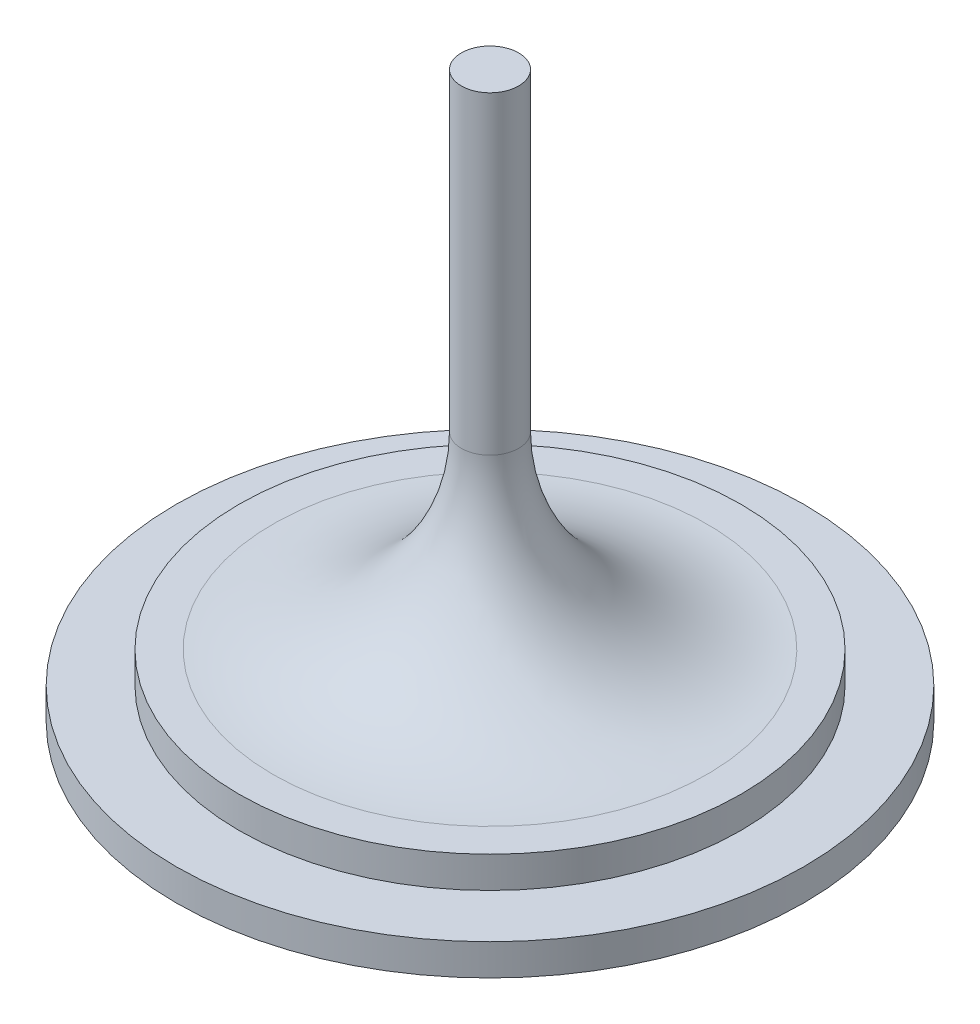
ISO-10303-21;
HEADER;
FILE_DESCRIPTION(('STEP AP214'),'2;1');
FILE_NAME('part.step','',(''),(''),'','','');
FILE_SCHEMA(('AUTOMOTIVE_DESIGN { 1 0 10303 214 1 1 1 1 }'));
ENDSEC;
DATA;
#1=APPLICATION_CONTEXT('core data for automotive mechanical design processes');
#2=APPLICATION_PROTOCOL_DEFINITION('international standard','automotive_design',2000,#1);
#3=PRODUCT_CONTEXT('',#1,'mechanical');
#4=PRODUCT('Part','Part','',(#3));
#5=PRODUCT_RELATED_PRODUCT_CATEGORY('part','',(#4));
#6=PRODUCT_DEFINITION_FORMATION('','',#4);
#7=PRODUCT_DEFINITION_CONTEXT('part definition',#1,'design');
#8=PRODUCT_DEFINITION('design','',#6,#7);
#9=PRODUCT_DEFINITION_SHAPE('','',#8);
#10=(LENGTH_UNIT() NAMED_UNIT(*) SI_UNIT(.MILLI.,.METRE.));
#11=(NAMED_UNIT(*) PLANE_ANGLE_UNIT() SI_UNIT($,.RADIAN.));
#12=(NAMED_UNIT(*) SI_UNIT($,.STERADIAN.) SOLID_ANGLE_UNIT());
#13=UNCERTAINTY_MEASURE_WITH_UNIT(LENGTH_MEASURE(1.E-05),#10,'distance_accuracy_value','');
#14=(GEOMETRIC_REPRESENTATION_CONTEXT(3) GLOBAL_UNCERTAINTY_ASSIGNED_CONTEXT((#13)) GLOBAL_UNIT_ASSIGNED_CONTEXT((#10,
#11,#12)) REPRESENTATION_CONTEXT('',''));
#15=CARTESIAN_POINT('',(0.,0.,0.));
#16=DIRECTION('',(0.,0.,1.));
#17=DIRECTION('',(1.,0.,0.));
#18=AXIS2_PLACEMENT_3D('',#15,#16,#17);
#19=CARTESIAN_POINT('',(2.9,57.15,0.));
#20=DIRECTION('',(0.,-1.,0.));
#21=DIRECTION('',(0.,0.,-1.));
#22=AXIS2_PLACEMENT_3D('',#19,#20,#21);
#23=PLANE('',#22);
#24=CARTESIAN_POINT('',(0.,57.15,0.));
#25=DIRECTION('',(0.,1.,0.));
#26=DIRECTION('',(0.,0.,1.));
#27=AXIS2_PLACEMENT_3D('',#24,#25,#26);
#28=CIRCLE('',#27,2.9);
#29=CARTESIAN_POINT('',(0.,57.15,2.9));
#30=VERTEX_POINT('',#29);
#31=EDGE_CURVE('E10',#30,#30,#28,.T.);
#32=ORIENTED_EDGE('',*,*,#31,.T.);
#33=EDGE_LOOP('',(#32));
#34=FACE_BOUND('',#33,.T.);
#35=ADVANCED_FACE('F43',(#34),#23,.F.);
#36=CARTESIAN_POINT('',(0.,0.,0.));
#37=DIRECTION('',(0.,1.,0.));
#38=DIRECTION('',(0.,0.,1.));
#39=AXIS2_PLACEMENT_3D('',#36,#37,#38);
#40=CYLINDRICAL_SURFACE('',#39,2.9);
#41=ORIENTED_EDGE('',*,*,#31,.F.);
#42=EDGE_LOOP('',(#41));
#43=FACE_BOUND('',#42,.T.);
#44=CARTESIAN_POINT('',(0.,25.4,0.));
#45=DIRECTION('',(0.,1.,0.));
#46=DIRECTION('',(0.,0.,1.));
#47=AXIS2_PLACEMENT_3D('',#44,#45,#46);
#48=CIRCLE('',#47,2.9);
#49=CARTESIAN_POINT('',(0.,25.4,2.9));
#50=VERTEX_POINT('',#49);
#51=EDGE_CURVE('E50',#50,#50,#48,.T.);
#52=ORIENTED_EDGE('',*,*,#51,.T.);
#53=EDGE_LOOP('',(#52));
#54=FACE_BOUND('',#53,.T.);
#55=ADVANCED_FACE('F91',(#43,#54),#40,.T.);
#56=CARTESIAN_POINT('',(0.,25.4,0.));
#57=DIRECTION('',(0.,1.,0.));
#58=DIRECTION('',(0.,0.,1.));
#59=AXIS2_PLACEMENT_3D('',#56,#57,#58);
#60=TOROIDAL_SURFACE('',#59,21.95,19.05);
#61=ORIENTED_EDGE('',*,*,#51,.F.);
#62=EDGE_LOOP('',(#61));
#63=FACE_BOUND('',#62,.T.);
#64=CARTESIAN_POINT('',(0.,6.35,0.));
#65=DIRECTION('',(0.,1.,0.));
#66=DIRECTION('',(0.,0.,1.));
#67=AXIS2_PLACEMENT_3D('',#64,#65,#66);
#68=CIRCLE('',#67,21.95);
#69=CARTESIAN_POINT('',(0.,6.35,21.95));
#70=VERTEX_POINT('',#69);
#71=EDGE_CURVE('E55',#70,#70,#68,.T.);
#72=ORIENTED_EDGE('',*,*,#71,.T.);
#73=EDGE_LOOP('',(#72));
#74=FACE_BOUND('',#73,.T.);
#75=ADVANCED_FACE('F95',(#63,#74),#60,.F.);
#76=CARTESIAN_POINT('',(21.95,6.35,0.));
#77=DIRECTION('',(0.,-1.,0.));
#78=DIRECTION('',(0.,0.,-1.));
#79=AXIS2_PLACEMENT_3D('',#76,#77,#78);
#80=PLANE('',#79);
#81=ORIENTED_EDGE('',*,*,#71,.F.);
#82=EDGE_LOOP('',(#81));
#83=FACE_BOUND('',#82,.T.);
#84=CARTESIAN_POINT('',(0.,6.35,0.));
#85=DIRECTION('',(0.,1.,0.));
#86=DIRECTION('',(0.,0.,1.));
#87=AXIS2_PLACEMENT_3D('',#84,#85,#86);
#88=CIRCLE('',#87,25.4);
#89=CARTESIAN_POINT('',(0.,6.35,25.4));
#90=VERTEX_POINT('',#89);
#91=EDGE_CURVE('E60',#90,#90,#88,.T.);
#92=ORIENTED_EDGE('',*,*,#91,.T.);
#93=EDGE_LOOP('',(#92));
#94=FACE_BOUND('',#93,.T.);
#95=ADVANCED_FACE('F100',(#83,#94),#80,.F.);
#96=CARTESIAN_POINT('',(0.,0.,0.));
#97=DIRECTION('',(0.,1.,0.));
#98=DIRECTION('',(0.,0.,1.));
#99=AXIS2_PLACEMENT_3D('',#96,#97,#98);
#100=CYLINDRICAL_SURFACE('',#99,25.4);
#101=ORIENTED_EDGE('',*,*,#91,.F.);
#102=EDGE_LOOP('',(#101));
#103=FACE_BOUND('',#102,.T.);
#104=CARTESIAN_POINT('',(0.,3.175,0.));
#105=DIRECTION('',(0.,1.,0.));
#106=DIRECTION('',(0.,0.,1.));
#107=AXIS2_PLACEMENT_3D('',#104,#105,#106);
#108=CIRCLE('',#107,25.4);
#109=CARTESIAN_POINT('',(0.,3.175,25.4));
#110=VERTEX_POINT('',#109);
#111=EDGE_CURVE('E66',#110,#110,#108,.T.);
#112=ORIENTED_EDGE('',*,*,#111,.T.);
#113=EDGE_LOOP('',(#112));
#114=FACE_BOUND('',#113,.T.);
#115=ADVANCED_FACE('F106',(#103,#114),#100,.T.);
#116=CARTESIAN_POINT('',(25.4,3.175,0.));
#117=DIRECTION('',(0.,-1.,0.));
#118=DIRECTION('',(0.,0.,-1.));
#119=AXIS2_PLACEMENT_3D('',#116,#117,#118);
#120=PLANE('',#119);
#121=ORIENTED_EDGE('',*,*,#111,.F.);
#122=EDGE_LOOP('',(#121));
#123=FACE_BOUND('',#122,.T.);
#124=CARTESIAN_POINT('',(0.,3.175,0.));
#125=DIRECTION('',(0.,1.,0.));
#126=DIRECTION('',(0.,0.,1.));
#127=AXIS2_PLACEMENT_3D('',#124,#125,#126);
#128=CIRCLE('',#127,31.75);
#129=CARTESIAN_POINT('',(0.,3.175,31.75));
#130=VERTEX_POINT('',#129);
#131=EDGE_CURVE('E70',#130,#130,#128,.T.);
#132=ORIENTED_EDGE('',*,*,#131,.T.);
#133=EDGE_LOOP('',(#132));
#134=FACE_BOUND('',#133,.T.);
#135=ADVANCED_FACE('F87',(#123,#134),#120,.F.);
#136=CARTESIAN_POINT('',(0.,0.,0.));
#137=DIRECTION('',(0.,1.,0.));
#138=DIRECTION('',(0.,0.,1.));
#139=AXIS2_PLACEMENT_3D('',#136,#137,#138);
#140=CYLINDRICAL_SURFACE('',#139,31.75);
#141=ORIENTED_EDGE('',*,*,#131,.F.);
#142=EDGE_LOOP('',(#141));
#143=FACE_BOUND('',#142,.T.);
#144=CARTESIAN_POINT('',(0.,0.,0.));
#145=DIRECTION('',(0.,1.,0.));
#146=DIRECTION('',(0.,0.,1.));
#147=AXIS2_PLACEMENT_3D('',#144,#145,#146);
#148=CIRCLE('',#147,31.75);
#149=CARTESIAN_POINT('',(0.,0.,31.75));
#150=VERTEX_POINT('',#149);
#151=EDGE_CURVE('E74',#150,#150,#148,.T.);
#152=ORIENTED_EDGE('',*,*,#151,.T.);
#153=EDGE_LOOP('',(#152));
#154=FACE_BOUND('',#153,.T.);
#155=ADVANCED_FACE('F79',(#143,#154),#140,.T.);
#156=CARTESIAN_POINT('',(0.,0.,0.));
#157=DIRECTION('',(0.,1.,0.));
#158=DIRECTION('',(0.,0.,1.));
#159=AXIS2_PLACEMENT_3D('',#156,#157,#158);
#160=PLANE('',#159);
#161=ORIENTED_EDGE('',*,*,#151,.F.);
#162=EDGE_LOOP('',(#161));
#163=FACE_BOUND('',#162,.T.);
#164=ADVANCED_FACE('F81',(#163),#160,.F.);
#165=CLOSED_SHELL('',(#35,#55,#75,#95,#115,#135,#155,#164));
#166=MANIFOLD_SOLID_BREP('B2',#165);
#167=ADVANCED_BREP_SHAPE_REPRESENTATION('',(#18,#166),#14);
#168=SHAPE_DEFINITION_REPRESENTATION(#9,#167);
ENDSEC;
END-ISO-10303-21;
